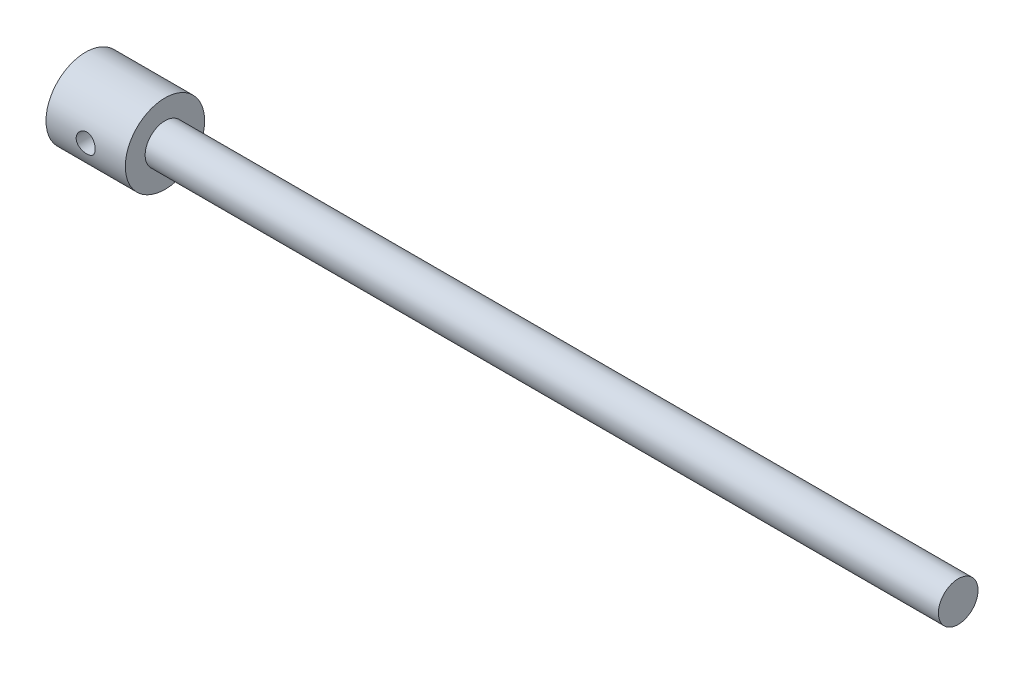
ISO-10303-21;
HEADER;
FILE_DESCRIPTION(('STEP AP214'),'2;1');
FILE_NAME('part.step','',(''),(''),'','','');
FILE_SCHEMA(('AUTOMOTIVE_DESIGN { 1 0 10303 214 1 1 1 1 }'));
ENDSEC;
DATA;
#1=APPLICATION_CONTEXT('core data for automotive mechanical design processes');
#2=APPLICATION_PROTOCOL_DEFINITION('international standard','automotive_design',2000,#1);
#3=PRODUCT_CONTEXT('',#1,'mechanical');
#4=PRODUCT('Part','Part','',(#3));
#5=PRODUCT_RELATED_PRODUCT_CATEGORY('part','',(#4));
#6=PRODUCT_DEFINITION_FORMATION('','',#4);
#7=PRODUCT_DEFINITION_CONTEXT('part definition',#1,'design');
#8=PRODUCT_DEFINITION('design','',#6,#7);
#9=PRODUCT_DEFINITION_SHAPE('','',#8);
#10=(LENGTH_UNIT() NAMED_UNIT(*) SI_UNIT(.MILLI.,.METRE.));
#11=(NAMED_UNIT(*) PLANE_ANGLE_UNIT() SI_UNIT($,.RADIAN.));
#12=(NAMED_UNIT(*) SI_UNIT($,.STERADIAN.) SOLID_ANGLE_UNIT());
#13=UNCERTAINTY_MEASURE_WITH_UNIT(LENGTH_MEASURE(1.E-05),#10,'distance_accuracy_value','');
#14=(GEOMETRIC_REPRESENTATION_CONTEXT(3) GLOBAL_UNCERTAINTY_ASSIGNED_CONTEXT((#13)) GLOBAL_UNIT_ASSIGNED_CONTEXT((#10,
#11,#12)) REPRESENTATION_CONTEXT('',''));
#15=CARTESIAN_POINT('',(0.,0.,0.));
#16=DIRECTION('',(0.,0.,1.));
#17=DIRECTION('',(1.,0.,0.));
#18=AXIS2_PLACEMENT_3D('',#15,#16,#17);
#19=CARTESIAN_POINT('',(0.,25.,0.));
#20=DIRECTION('',(1.,0.,0.));
#21=DIRECTION('',(0.,0.,-1.));
#22=AXIS2_PLACEMENT_3D('',#19,#20,#21);
#23=PLANE('',#22);
#24=CARTESIAN_POINT('',(0.,0.,0.));
#25=DIRECTION('',(-1.,0.,0.));
#26=DIRECTION('',(0.,0.,1.));
#27=AXIS2_PLACEMENT_3D('',#24,#25,#26);
#28=CIRCLE('',#27,25.);
#29=CARTESIAN_POINT('',(0.,0.,25.));
#30=VERTEX_POINT('',#29);
#31=EDGE_CURVE('E82',#30,#30,#28,.T.);
#32=ORIENTED_EDGE('',*,*,#31,.T.);
#33=EDGE_LOOP('',(#32));
#34=FACE_BOUND('',#33,.T.);
#35=ADVANCED_FACE('F40',(#34),#23,.F.);
#36=CARTESIAN_POINT('',(550.,0.,0.));
#37=DIRECTION('',(-1.,0.,0.));
#38=DIRECTION('',(0.,0.,1.));
#39=AXIS2_PLACEMENT_3D('',#36,#37,#38);
#40=PLANE('',#39);
#41=CARTESIAN_POINT('',(550.,0.,0.));
#42=DIRECTION('',(-1.,0.,0.));
#43=DIRECTION('',(0.,0.,1.));
#44=AXIS2_PLACEMENT_3D('',#41,#42,#43);
#45=CIRCLE('',#44,12.5);
#46=CARTESIAN_POINT('',(550.,0.,12.5));
#47=VERTEX_POINT('',#46);
#48=EDGE_CURVE('E55',#47,#47,#45,.T.);
#49=ORIENTED_EDGE('',*,*,#48,.F.);
#50=EDGE_LOOP('',(#49));
#51=FACE_BOUND('',#50,.T.);
#52=ADVANCED_FACE('F78',(#51),#40,.F.);
#53=CARTESIAN_POINT('',(0.,0.,0.));
#54=DIRECTION('',(-1.,0.,0.));
#55=DIRECTION('',(0.,0.,1.));
#56=AXIS2_PLACEMENT_3D('',#53,#54,#55);
#57=CYLINDRICAL_SURFACE('',#56,12.5);
#58=CARTESIAN_POINT('',(50.,0.,0.));
#59=DIRECTION('',(-1.,0.,0.));
#60=DIRECTION('',(0.,0.,1.));
#61=AXIS2_PLACEMENT_3D('',#58,#59,#60);
#62=CIRCLE('',#61,12.5);
#63=CARTESIAN_POINT('',(50.,0.,12.5));
#64=VERTEX_POINT('',#63);
#65=EDGE_CURVE('E57',#64,#64,#62,.T.);
#66=ORIENTED_EDGE('',*,*,#65,.F.);
#67=EDGE_LOOP('',(#66));
#68=FACE_BOUND('',#67,.T.);
#69=ORIENTED_EDGE('',*,*,#48,.T.);
#70=EDGE_LOOP('',(#69));
#71=FACE_BOUND('',#70,.T.);
#72=ADVANCED_FACE('F83',(#68,#71),#57,.T.);
#73=CARTESIAN_POINT('',(50.,12.5,0.));
#74=DIRECTION('',(-1.,0.,0.));
#75=DIRECTION('',(0.,0.,1.));
#76=AXIS2_PLACEMENT_3D('',#73,#74,#75);
#77=PLANE('',#76);
#78=CARTESIAN_POINT('',(50.,0.,0.));
#79=DIRECTION('',(-1.,0.,0.));
#80=DIRECTION('',(0.,0.,1.));
#81=AXIS2_PLACEMENT_3D('',#78,#79,#80);
#82=CIRCLE('',#81,25.);
#83=CARTESIAN_POINT('',(50.,0.,25.));
#84=VERTEX_POINT('',#83);
#85=EDGE_CURVE('E90',#84,#84,#82,.T.);
#86=ORIENTED_EDGE('',*,*,#85,.F.);
#87=EDGE_LOOP('',(#86));
#88=FACE_BOUND('',#87,.T.);
#89=ORIENTED_EDGE('',*,*,#65,.T.);
#90=EDGE_LOOP('',(#89));
#91=FACE_BOUND('',#90,.T.);
#92=ADVANCED_FACE('F71',(#88,#91),#77,.F.);
#93=CARTESIAN_POINT('',(0.,0.,0.));
#94=DIRECTION('',(-1.,0.,0.));
#95=DIRECTION('',(0.,0.,1.));
#96=AXIS2_PLACEMENT_3D('',#93,#94,#95);
#97=CYLINDRICAL_SURFACE('',#96,25.);
#98=CARTESIAN_POINT('',(31.,0.,-25.));
#99=CARTESIAN_POINT('',(31.0000045654021,0.166017736340745,-25.0000026804997));
#100=CARTESIAN_POINT('',(30.9931083315099,0.331984064130571,-24.9983437383731));
#101=CARTESIAN_POINT('',(30.9655909900526,0.662757375273785,-24.9917601768854));
#102=CARTESIAN_POINT('',(30.9449681517169,0.827564209779564,-24.9868351457074));
#103=CARTESIAN_POINT('',(30.8901535848326,1.15483168687375,-24.9738504635424));
#104=CARTESIAN_POINT('',(30.855957043403,1.31729147606247,-24.9657897007271));
#105=CARTESIAN_POINT('',(30.7742619207701,1.63872050759381,-24.9467537443302));
#106=CARTESIAN_POINT('',(30.7267584397992,1.79768844089951,-24.9357774773038));
#107=CARTESIAN_POINT('',(30.6189154000372,2.11072366381165,-24.9112316091515));
#108=CARTESIAN_POINT('',(30.5585957367627,2.26479812859839,-24.897666030887));
#109=CARTESIAN_POINT('',(30.4255126504005,2.56731972417304,-24.8682925860487));
#110=CARTESIAN_POINT('',(30.3527446342751,2.71576475309531,-24.8524838922068));
#111=CARTESIAN_POINT('',(30.1953429094483,3.00593509691774,-24.8190587739081));
#112=CARTESIAN_POINT('',(30.1107137253609,3.14766294672407,-24.8014430394569));
#113=CARTESIAN_POINT('',(29.930128760191,3.42359889441685,-24.7648612187919));
#114=CARTESIAN_POINT('',(29.8341687278593,3.55780414185136,-24.7458946268123));
#115=CARTESIAN_POINT('',(29.6298945004368,3.81996752921303,-24.7067947855154));
#116=CARTESIAN_POINT('',(29.5214001376863,3.94778319107671,-24.6866473068088));
#117=CARTESIAN_POINT('',(29.2940876458784,4.19391043753479,-24.6460277155742));
#118=CARTESIAN_POINT('',(29.1752657022346,4.31221847908384,-24.6255554853983));
#119=CARTESIAN_POINT('',(28.9281491358483,4.53846894982133,-24.5848634527513));
#120=CARTESIAN_POINT('',(28.7998569991231,4.64641408237687,-24.5646435856504));
#121=CARTESIAN_POINT('',(28.5345631328875,4.85128465634762,-24.5250062264423));
#122=CARTESIAN_POINT('',(28.3975582064557,4.94820601608992,-24.5055890332168));
#123=CARTESIAN_POINT('',(28.1139109412451,5.1315149308875,-24.4678652790419));
#124=CARTESIAN_POINT('',(27.9671650785524,5.21774615640803,-24.4495768107614));
#125=CARTESIAN_POINT('',(27.6666458172853,5.37754406139993,-24.4149279468241));
#126=CARTESIAN_POINT('',(27.5128697930405,5.45110595933349,-24.3985682798489));
#127=CARTESIAN_POINT('',(27.1994677660297,5.58492026214268,-24.3682865029779));
#128=CARTESIAN_POINT('',(27.0398446450393,5.64517912327471,-24.354363211339));
#129=CARTESIAN_POINT('',(26.7158528745254,5.75195806967358,-24.3293636773731));
#130=CARTESIAN_POINT('',(26.5514825437586,5.79847322039682,-24.318288457803));
#131=CARTESIAN_POINT('',(26.0591991958386,5.91523377010967,-24.2902598679583));
#132=CARTESIAN_POINT('',(25.7258747491139,5.96534620186162,-24.2778811042379));
#133=CARTESIAN_POINT('',(25.2235243982438,5.99819895021148,-24.2697663322526));
#134=CARTESIAN_POINT('',(25.055614512631,6.00209048242323,-24.2688053008257));
#135=CARTESIAN_POINT('',(24.7200533387406,5.99581246294926,-24.2703574949624));
#136=CARTESIAN_POINT('',(24.5524020533586,5.98564275494965,-24.2728707591485));
#137=CARTESIAN_POINT('',(24.0592354379643,5.93483975630032,-24.285368999466));
#138=CARTESIAN_POINT('',(23.7356610926301,5.87440247397773,-24.3001939850224));
#139=CARTESIAN_POINT('',(23.1035551402389,5.70184242669471,-24.3412549446464));
#140=CARTESIAN_POINT('',(22.7950245310886,5.58971623816142,-24.3674916745551));
#141=CARTESIAN_POINT('',(22.1981876883057,5.3158825349441,-24.4286958367201));
#142=CARTESIAN_POINT('',(21.9100987536133,5.15371899452584,-24.4637429965247));
#143=CARTESIAN_POINT('',(21.3647873385141,4.78473374953621,-24.5385748778449));
#144=CARTESIAN_POINT('',(21.1075698769834,4.57790479882186,-24.5783603675971));
#145=CARTESIAN_POINT('',(20.6242138778088,4.11902988641842,-24.6594640880418));
#146=CARTESIAN_POINT('',(20.3990660746999,3.86594129003371,-24.7007951674045));
#147=CARTESIAN_POINT('',(19.9942302876759,3.32511184695823,-24.7793903091839));
#148=CARTESIAN_POINT('',(19.8145434865743,3.03737009894219,-24.8166542657671));
#149=CARTESIAN_POINT('',(19.5054056318309,2.43405695507431,-24.8830789940348));
#150=CARTESIAN_POINT('',(19.3761051057317,2.11840557448716,-24.9122154123614));
#151=CARTESIAN_POINT('',(19.1726698236987,1.46899521159138,-24.9589240940734));
#152=CARTESIAN_POINT('',(19.0985253649671,1.13523942521409,-24.9764983913503));
#153=CARTESIAN_POINT('',(19.0089958704804,0.467574800827577,-24.9978055089126));
#154=CARTESIAN_POINT('',(18.9922601968733,0.133856966575299,-25.0018564268946));
#155=CARTESIAN_POINT('',(19.0143335519038,-0.531608768658084,-24.9965614831509));
#156=CARTESIAN_POINT('',(19.053137996564,-0.863356829944317,-24.9872167270307));
#157=CARTESIAN_POINT('',(19.1840738854237,-1.51084514007902,-24.9563832816127));
#158=CARTESIAN_POINT('',(19.2754779523593,-1.8267410839496,-24.9350603275565));
#159=CARTESIAN_POINT('',(19.5081966502045,-2.4387066749497,-24.8826669936479));
#160=CARTESIAN_POINT('',(19.6495160816406,-2.73477441187555,-24.8515956762951));
#161=CARTESIAN_POINT('',(19.9807321749523,-3.30412273668564,-24.7823820658762));
#162=CARTESIAN_POINT('',(20.171397626969,-3.57694246966835,-24.7441307708391));
#163=CARTESIAN_POINT('',(20.5949176655097,-4.08719914724013,-24.6649871461435));
#164=CARTESIAN_POINT('',(20.8277789307352,-4.32463047973872,-24.6240943990595));
#165=CARTESIAN_POINT('',(21.3352671241418,-4.76284500809665,-24.5431489449983));
#166=CARTESIAN_POINT('',(21.6107154179113,-4.96268414096836,-24.5031358001301));
#167=CARTESIAN_POINT('',(22.1922356795911,-5.31333575577366,-24.4295058119813));
#168=CARTESIAN_POINT('',(22.4983062754937,-5.46415043292341,-24.3958886823281));
#169=CARTESIAN_POINT('',(22.9725936839859,-5.64963439053451,-24.353347630646));
#170=CARTESIAN_POINT('',(23.1328069566145,-5.70458710242878,-24.3405033891164));
#171=CARTESIAN_POINT('',(23.457482020032,-5.80079732294278,-24.3177552029261));
#172=CARTESIAN_POINT('',(23.6219421871433,-5.84205998439171,-24.3078501521252));
#173=CARTESIAN_POINT('',(23.9539179032292,-5.91053741786634,-24.2912903166139));
#174=CARTESIAN_POINT('',(24.1214335511052,-5.93775173433045,-24.2846356373074));
#175=CARTESIAN_POINT('',(24.4582664668551,-5.97789965204539,-24.2747841701866));
#176=CARTESIAN_POINT('',(24.6275836538608,-5.99083389159895,-24.2715872278157));
#177=CARTESIAN_POINT('',(24.9622487305118,-6.00215499594078,-24.2687899616173));
#178=CARTESIAN_POINT('',(25.1275832844736,-6.00091722515411,-24.2690968340135));
#179=CARTESIAN_POINT('',(25.4575435219348,-5.98480872784869,-24.2730742483489));
#180=CARTESIAN_POINT('',(25.6221692208079,-5.969938298505,-24.2767447169658));
#181=CARTESIAN_POINT('',(25.9495546015662,-5.92668661056588,-24.2873399112073));
#182=CARTESIAN_POINT('',(26.1123139864983,-5.89830323162515,-24.294265147542));
#183=CARTESIAN_POINT('',(26.4347302014815,-5.82827196779404,-24.3111608262961));
#184=CARTESIAN_POINT('',(26.59438810625,-5.78662876790753,-24.3211301931022));
#185=CARTESIAN_POINT('',(26.9088075189712,-5.69063662986335,-24.3437686465433));
#186=CARTESIAN_POINT('',(27.0635886271826,-5.63634876916799,-24.3564247302984));
#187=CARTESIAN_POINT('',(27.3679533881392,-5.51539707483437,-24.3840980883562));
#188=CARTESIAN_POINT('',(27.5175388295994,-5.44873755154826,-24.3991145400161));
#189=CARTESIAN_POINT('',(27.8106621669156,-5.30348427217981,-24.4310987091683));
#190=CARTESIAN_POINT('',(27.9541973483356,-5.22488523075194,-24.4480672900111));
#191=CARTESIAN_POINT('',(28.2341911451689,-5.05635243091258,-24.4834782828489));
#192=CARTESIAN_POINT('',(28.3706520835145,-4.96642242689347,-24.5019202059306));
#193=CARTESIAN_POINT('',(28.6389503832923,-4.77346921711415,-24.5402505889388));
#194=CARTESIAN_POINT('',(28.7705923311298,-4.67017903544834,-24.5601634300574));
#195=CARTESIAN_POINT('',(29.02470841849,-4.45304880482868,-24.600458146359));
#196=CARTESIAN_POINT('',(29.1471856811228,-4.33921237965749,-24.6208398586377));
#197=CARTESIAN_POINT('',(29.3822931129819,-4.10164015488732,-24.661530300392));
#198=CARTESIAN_POINT('',(29.4949174263774,-3.97789855094998,-24.6818389796797));
#199=CARTESIAN_POINT('',(29.7094481047576,-3.7214296777047,-24.7218081005976));
#200=CARTESIAN_POINT('',(29.8113583669331,-3.58870570477298,-24.7414687761375));
#201=CARTESIAN_POINT('',(30.0054239224954,-3.31280088827595,-24.7799327781137));
#202=CARTESIAN_POINT('',(30.0973872483625,-3.16948213881107,-24.7987162302532));
#203=CARTESIAN_POINT('',(30.2688530722884,-2.8754381763477,-24.8345280560803));
#204=CARTESIAN_POINT('',(30.3483601559727,-2.72471571591034,-24.8515570748485));
#205=CARTESIAN_POINT('',(30.4943122871475,-2.41692354679156,-24.883375777664));
#206=CARTESIAN_POINT('',(30.5607634733439,-2.25985686316148,-24.8981665133663));
#207=CARTESIAN_POINT('',(30.6801042720391,-1.94048744711082,-24.9250921884147));
#208=CARTESIAN_POINT('',(30.7329960562763,-1.77818555787967,-24.9372275530119));
#209=CARTESIAN_POINT('',(30.8520251734541,-1.35190448336008,-24.9647957983314));
#210=CARTESIAN_POINT('',(30.9074241484908,-1.08469226075994,-24.9779181465939));
#211=CARTESIAN_POINT('',(30.9814066442059,-0.544940331071899,-24.9955177731159));
#212=CARTESIAN_POINT('',(30.9999925091139,-0.272400964328514,-24.9999956018512));
#213=CARTESIAN_POINT('',(31.,0.,-25.));
#214=B_SPLINE_CURVE_WITH_KNOTS('',3,(#98,#99,#100,#101,#102,#103,#104,#105,#106,#107,#108,#109,
#110,#111,#112,#113,#114,#115,#116,#117,#118,#119,#120,#121,#122,#123,#124,#125,#126,#127,#128,
#129,#130,#131,#132,#133,#134,#135,#136,#137,#138,#139,#140,#141,#142,#143,#144,#145,#146,#147,
#148,#149,#150,#151,#152,#153,#154,#155,#156,#157,#158,#159,#160,#161,#162,#163,#164,#165,#166,
#167,#168,#169,#170,#171,#172,#173,#174,#175,#176,#177,#178,#179,#180,#181,#182,#183,#184,#185,
#186,#187,#188,#189,#190,#191,#192,#193,#194,#195,#196,#197,#198,#199,#200,#201,#202,#203,#204,
#205,#206,#207,#208,#209,#210,#211,#212,#213),.UNSPECIFIED.,.T.,.F.,(4,2,2,2,2,2,2,2,2,2,2,2,2,
2,2,2,2,2,2,2,2,2,2,2,2,2,2,2,2,2,2,2,2,2,2,2,2,2,2,2,2,2,2,2,2,2,2,2,2,2,2,2,2,2,2,2,2,4),(0.,
0.497813360100955,0.995689500769747,1.49374233325073,1.99197879609469,2.4894473877073,
2.98709992652941,3.48456314269129,3.98221359994714,4.48820831908741,4.99439073274951,
5.50044073797176,6.00667750796929,6.51961190143619,7.03273945954076,7.54561743540079,
8.05867933189507,9.06463756237654,9.56800871792682,10.0713854693234,11.0548629550302,
12.0384055899336,13.0311908061742,14.0241372047509,15.0430966233895,16.0620825507942,
17.0840897493149,18.1059171185591,19.1035329919673,20.1010665323702,21.085126203147,
22.069280539993,23.0698021185097,24.0704821968969,25.0936623603892,26.1167967016263,
26.6258643414059,27.1347401541084,27.6436324676663,28.1525020334114,28.6479253897995,
29.1433379468293,29.6388282657176,30.1341437102249,30.6271145113294,31.1199138801486,
31.6129320389053,32.105787268885,32.6107272666003,33.1154944014541,33.6205595212516,
34.1254402854413,34.6387770201076,35.1519243293048,35.6648297831432,36.1776530362049,
36.9945144051894,37.8113237554193),.UNSPECIFIED.);
#215=CARTESIAN_POINT('',(31.,0.,-25.));
#216=VERTEX_POINT('',#215);
#217=EDGE_CURVE('E10',#216,#216,#214,.T.);
#218=ORIENTED_EDGE('',*,*,#217,.T.);
#219=EDGE_LOOP('',(#218));
#220=FACE_BOUND('',#219,.T.);
#221=CARTESIAN_POINT('',(31.,0.,25.));
#222=CARTESIAN_POINT('',(31.0000045654021,-0.166017736340744,25.0000026804997));
#223=CARTESIAN_POINT('',(30.9931083315099,-0.331984064130571,24.9983437383731));
#224=CARTESIAN_POINT('',(30.9655909900526,-0.662757375273784,24.9917601768854));
#225=CARTESIAN_POINT('',(30.9449681517169,-0.827564209779563,24.9868351457074));
#226=CARTESIAN_POINT('',(30.8901535848326,-1.15483168687374,24.9738504635424));
#227=CARTESIAN_POINT('',(30.855957043403,-1.31729147606247,24.9657897007271));
#228=CARTESIAN_POINT('',(30.7742619207701,-1.63872050759381,24.9467537443302));
#229=CARTESIAN_POINT('',(30.7267584397992,-1.79768844089951,24.9357774773038));
#230=CARTESIAN_POINT('',(30.6189154000372,-2.11072366381165,24.9112316091515));
#231=CARTESIAN_POINT('',(30.5585957367627,-2.26479812859838,24.897666030887));
#232=CARTESIAN_POINT('',(30.4255126504005,-2.56731972417304,24.8682925860487));
#233=CARTESIAN_POINT('',(30.3527446342751,-2.7157647530953,24.8524838922068));
#234=CARTESIAN_POINT('',(30.1953429094483,-3.00593509691774,24.8190587739081));
#235=CARTESIAN_POINT('',(30.1107137253609,-3.14766294672406,24.8014430394569));
#236=CARTESIAN_POINT('',(29.930128760191,-3.42359889441685,24.7648612187919));
#237=CARTESIAN_POINT('',(29.8341687278593,-3.55780414185136,24.7458946268123));
#238=CARTESIAN_POINT('',(29.6298945004368,-3.81996752921303,24.7067947855154));
#239=CARTESIAN_POINT('',(29.5214001376863,-3.94778319107671,24.6866473068088));
#240=CARTESIAN_POINT('',(29.2940876458784,-4.19391043753479,24.6460277155742));
#241=CARTESIAN_POINT('',(29.1752657022346,-4.31221847908383,24.6255554853983));
#242=CARTESIAN_POINT('',(28.9281491358483,-4.53846894982133,24.5848634527513));
#243=CARTESIAN_POINT('',(28.7998569991231,-4.64641408237686,24.5646435856504));
#244=CARTESIAN_POINT('',(28.5345631328875,-4.85128465634761,24.5250062264423));
#245=CARTESIAN_POINT('',(28.3975582064557,-4.94820601608992,24.5055890332168));
#246=CARTESIAN_POINT('',(28.1139109412451,-5.1315149308875,24.4678652790419));
#247=CARTESIAN_POINT('',(27.9671650785524,-5.21774615640802,24.4495768107614));
#248=CARTESIAN_POINT('',(27.6666458172853,-5.37754406139992,24.4149279468241));
#249=CARTESIAN_POINT('',(27.5128697930405,-5.45110595933348,24.3985682798489));
#250=CARTESIAN_POINT('',(27.1994677660297,-5.58492026214268,24.3682865029779));
#251=CARTESIAN_POINT('',(27.0398446450393,-5.6451791232747,24.354363211339));
#252=CARTESIAN_POINT('',(26.7158528745254,-5.75195806967358,24.3293636773731));
#253=CARTESIAN_POINT('',(26.5514825437586,-5.79847322039682,24.318288457803));
#254=CARTESIAN_POINT('',(26.0591991958386,-5.91523377010967,24.2902598679583));
#255=CARTESIAN_POINT('',(25.7258747491139,-5.96534620186162,24.2778811042379));
#256=CARTESIAN_POINT('',(25.2235243982438,-5.99819895021148,24.2697663322526));
#257=CARTESIAN_POINT('',(25.055614512631,-6.00209048242323,24.2688053008257));
#258=CARTESIAN_POINT('',(24.7200533387406,-5.99581246294926,24.2703574949624));
#259=CARTESIAN_POINT('',(24.5524020533586,-5.98564275494965,24.2728707591485));
#260=CARTESIAN_POINT('',(24.0592354379643,-5.93483975630032,24.285368999466));
#261=CARTESIAN_POINT('',(23.7356610926301,-5.87440247397773,24.3001939850224));
#262=CARTESIAN_POINT('',(23.1035551402389,-5.70184242669471,24.3412549446464));
#263=CARTESIAN_POINT('',(22.7950245310886,-5.58971623816142,24.3674916745551));
#264=CARTESIAN_POINT('',(22.1981876883057,-5.3158825349441,24.4286958367201));
#265=CARTESIAN_POINT('',(21.9100987536133,-5.15371899452584,24.4637429965247));
#266=CARTESIAN_POINT('',(21.3647873385141,-4.78473374953622,24.5385748778448));
#267=CARTESIAN_POINT('',(21.1075698769834,-4.57790479882186,24.5783603675971));
#268=CARTESIAN_POINT('',(20.6242138778088,-4.11902988641842,24.6594640880418));
#269=CARTESIAN_POINT('',(20.3990660746999,-3.86594129003371,24.7007951674045));
#270=CARTESIAN_POINT('',(19.9942302876759,-3.32511184695823,24.7793903091839));
#271=CARTESIAN_POINT('',(19.8145434865743,-3.03737009894219,24.8166542657671));
#272=CARTESIAN_POINT('',(19.5054056318309,-2.43405695507431,24.8830789940348));
#273=CARTESIAN_POINT('',(19.3761051057317,-2.11840557448716,24.9122154123614));
#274=CARTESIAN_POINT('',(19.1726698236987,-1.46899521159138,24.9589240940734));
#275=CARTESIAN_POINT('',(19.0985253649671,-1.13523942521409,24.9764983913503));
#276=CARTESIAN_POINT('',(19.0089958704804,-0.467574800827578,24.9978055089126));
#277=CARTESIAN_POINT('',(18.9922601968733,-0.1338569665753,25.0018564268946));
#278=CARTESIAN_POINT('',(19.0143335519038,0.531608768658083,24.9965614831509));
#279=CARTESIAN_POINT('',(19.053137996564,0.863356829944315,24.9872167270307));
#280=CARTESIAN_POINT('',(19.1840738854237,1.51084514007901,24.9563832816127));
#281=CARTESIAN_POINT('',(19.2754779523593,1.8267410839496,24.9350603275565));
#282=CARTESIAN_POINT('',(19.5081966502045,2.4387066749497,24.8826669936479));
#283=CARTESIAN_POINT('',(19.6495160816406,2.73477441187555,24.8515956762951));
#284=CARTESIAN_POINT('',(19.9807321749523,3.30412273668563,24.7823820658762));
#285=CARTESIAN_POINT('',(20.171397626969,3.57694246966834,24.7441307708391));
#286=CARTESIAN_POINT('',(20.5949176655097,4.08719914724013,24.6649871461435));
#287=CARTESIAN_POINT('',(20.8277789307352,4.32463047973871,24.6240943990595));
#288=CARTESIAN_POINT('',(21.3352671241417,4.76284500809665,24.5431489449983));
#289=CARTESIAN_POINT('',(21.6107154179113,4.96268414096836,24.5031358001301));
#290=CARTESIAN_POINT('',(22.1922356795911,5.31333575577366,24.4295058119813));
#291=CARTESIAN_POINT('',(22.4983062754937,5.46415043292341,24.395888682328));
#292=CARTESIAN_POINT('',(22.9725936839859,5.64963439053451,24.353347630646));
#293=CARTESIAN_POINT('',(23.1328069566145,5.70458710242878,24.3405033891164));
#294=CARTESIAN_POINT('',(23.457482020032,5.80079732294278,24.3177552029261));
#295=CARTESIAN_POINT('',(23.6219421871433,5.84205998439171,24.3078501521252));
#296=CARTESIAN_POINT('',(23.9539179032292,5.91053741786634,24.2912903166139));
#297=CARTESIAN_POINT('',(24.1214335511052,5.93775173433045,24.2846356373074));
#298=CARTESIAN_POINT('',(24.4582664668551,5.97789965204539,24.2747841701866));
#299=CARTESIAN_POINT('',(24.6275836538608,5.99083389159895,24.2715872278157));
#300=CARTESIAN_POINT('',(24.9622487305118,6.00215499594078,24.2687899616173));
#301=CARTESIAN_POINT('',(25.1275832844736,6.00091722515411,24.2690968340135));
#302=CARTESIAN_POINT('',(25.4575435219348,5.98480872784869,24.2730742483489));
#303=CARTESIAN_POINT('',(25.6221692208079,5.969938298505,24.2767447169658));
#304=CARTESIAN_POINT('',(25.9495546015662,5.92668661056588,24.2873399112073));
#305=CARTESIAN_POINT('',(26.1123139864983,5.89830323162515,24.294265147542));
#306=CARTESIAN_POINT('',(26.4347302014815,5.82827196779404,24.3111608262961));
#307=CARTESIAN_POINT('',(26.59438810625,5.78662876790753,24.3211301931022));
#308=CARTESIAN_POINT('',(26.9088075189712,5.69063662986335,24.3437686465433));
#309=CARTESIAN_POINT('',(27.0635886271826,5.63634876916799,24.3564247302984));
#310=CARTESIAN_POINT('',(27.3679533881392,5.51539707483437,24.3840980883562));
#311=CARTESIAN_POINT('',(27.5175388295994,5.44873755154826,24.3991145400161));
#312=CARTESIAN_POINT('',(27.8106621669156,5.30348427217982,24.4310987091682));
#313=CARTESIAN_POINT('',(27.9541973483356,5.22488523075194,24.4480672900111));
#314=CARTESIAN_POINT('',(28.2341911451689,5.05635243091258,24.4834782828489));
#315=CARTESIAN_POINT('',(28.3706520835145,4.96642242689348,24.5019202059306));
#316=CARTESIAN_POINT('',(28.6389503832923,4.77346921711415,24.5402505889388));
#317=CARTESIAN_POINT('',(28.7705923311298,4.67017903544834,24.5601634300574));
#318=CARTESIAN_POINT('',(29.02470841849,4.45304880482869,24.600458146359));
#319=CARTESIAN_POINT('',(29.1471856811228,4.33921237965749,24.6208398586377));
#320=CARTESIAN_POINT('',(29.3822931129819,4.10164015488732,24.661530300392));
#321=CARTESIAN_POINT('',(29.4949174263774,3.97789855094999,24.6818389796797));
#322=CARTESIAN_POINT('',(29.7094481047576,3.7214296777047,24.7218081005976));
#323=CARTESIAN_POINT('',(29.8113583669331,3.58870570477299,24.7414687761375));
#324=CARTESIAN_POINT('',(30.0054239224954,3.31280088827596,24.7799327781137));
#325=CARTESIAN_POINT('',(30.0973872483625,3.16948213881108,24.7987162302532));
#326=CARTESIAN_POINT('',(30.2688530722884,2.87543817634771,24.8345280560803));
#327=CARTESIAN_POINT('',(30.3483601559727,2.72471571591035,24.8515570748485));
#328=CARTESIAN_POINT('',(30.4943122871475,2.41692354679156,24.883375777664));
#329=CARTESIAN_POINT('',(30.5607634733439,2.25985686316148,24.8981665133663));
#330=CARTESIAN_POINT('',(30.6801042720391,1.94048744711082,24.9250921884147));
#331=CARTESIAN_POINT('',(30.7329960562763,1.77818555787967,24.9372275530119));
#332=CARTESIAN_POINT('',(30.8520251734541,1.35190448336008,24.9647957983314));
#333=CARTESIAN_POINT('',(30.9074241484908,1.08469226075994,24.9779181465939));
#334=CARTESIAN_POINT('',(30.9814066442059,0.544940331071902,24.995517773116));
#335=CARTESIAN_POINT('',(30.9999925091139,0.272400964328515,24.9999956018512));
#336=CARTESIAN_POINT('',(31.,0.,25.));
#337=B_SPLINE_CURVE_WITH_KNOTS('',3,(#221,#222,#223,#224,#225,#226,#227,#228,#229,#230,#231,
#232,#233,#234,#235,#236,#237,#238,#239,#240,#241,#242,#243,#244,#245,#246,#247,#248,#249,#250,
#251,#252,#253,#254,#255,#256,#257,#258,#259,#260,#261,#262,#263,#264,#265,#266,#267,#268,#269,
#270,#271,#272,#273,#274,#275,#276,#277,#278,#279,#280,#281,#282,#283,#284,#285,#286,#287,#288,
#289,#290,#291,#292,#293,#294,#295,#296,#297,#298,#299,#300,#301,#302,#303,#304,#305,#306,#307,
#308,#309,#310,#311,#312,#313,#314,#315,#316,#317,#318,#319,#320,#321,#322,#323,#324,#325,#326,
#327,#328,#329,#330,#331,#332,#333,#334,#335,#336),.UNSPECIFIED.,.T.,.F.,(4,2,2,2,2,2,2,2,2,2,2,
2,2,2,2,2,2,2,2,2,2,2,2,2,2,2,2,2,2,2,2,2,2,2,2,2,2,2,2,2,2,2,2,2,2,2,2,2,2,2,2,2,2,2,2,2,2,4),
(0.,0.497813360100954,0.995689500769746,1.49374233325073,1.99197879609469,2.4894473877073,
2.98709992652941,3.48456314269129,3.98221359994714,4.48820831908741,4.9943907327495,
5.50044073797176,6.00667750796928,6.51961190143619,7.03273945954075,7.54561743540079,
8.05867933189507,9.06463756237653,9.56800871792681,10.0713854693234,11.0548629550302,
12.0384055899336,13.0311908061742,14.0241372047509,15.0430966233895,16.0620825507942,
17.0840897493149,18.1059171185591,19.1035329919673,20.1010665323702,21.085126203147,
22.069280539993,23.0698021185097,24.0704821968969,25.0936623603892,26.1167967016263,
26.6258643414059,27.1347401541084,27.6436324676663,28.1525020334114,28.6479253897995,
29.1433379468293,29.6388282657176,30.1341437102249,30.6271145113294,31.1199138801486,
31.6129320389053,32.105787268885,32.6107272666003,33.1154944014541,33.6205595212516,
34.1254402854413,34.6387770201076,35.1519243293048,35.6648297831432,36.1776530362049,
36.9945144051894,37.8113237554193),.UNSPECIFIED.);
#338=CARTESIAN_POINT('',(31.,0.,25.));
#339=VERTEX_POINT('',#338);
#340=EDGE_CURVE('E48',#339,#339,#337,.T.);
#341=ORIENTED_EDGE('',*,*,#340,.T.);
#342=EDGE_LOOP('',(#341));
#343=FACE_BOUND('',#342,.T.);
#344=ORIENTED_EDGE('',*,*,#31,.F.);
#345=EDGE_LOOP('',(#344));
#346=FACE_BOUND('',#345,.T.);
#347=ORIENTED_EDGE('',*,*,#85,.T.);
#348=EDGE_LOOP('',(#347));
#349=FACE_BOUND('',#348,.T.);
#350=ADVANCED_FACE('F65',(#220,#343,#346,#349),#97,.T.);
#351=CARTESIAN_POINT('',(25.,0.,-25.));
#352=DIRECTION('',(0.,0.,1.));
#353=DIRECTION('',(1.,0.,0.));
#354=AXIS2_PLACEMENT_3D('',#351,#352,#353);
#355=CYLINDRICAL_SURFACE('',#354,6.);
#356=ORIENTED_EDGE('',*,*,#340,.F.);
#357=EDGE_LOOP('',(#356));
#358=FACE_BOUND('',#357,.T.);
#359=ORIENTED_EDGE('',*,*,#217,.F.);
#360=EDGE_LOOP('',(#359));
#361=FACE_BOUND('',#360,.T.);
#362=ADVANCED_FACE('F64',(#358,#361),#355,.F.);
#363=CLOSED_SHELL('',(#35,#52,#72,#92,#350,#362));
#364=MANIFOLD_SOLID_BREP('B2',#363);
#365=ADVANCED_BREP_SHAPE_REPRESENTATION('',(#18,#364),#14);
#366=SHAPE_DEFINITION_REPRESENTATION(#9,#365);
ENDSEC;
END-ISO-10303-21;
